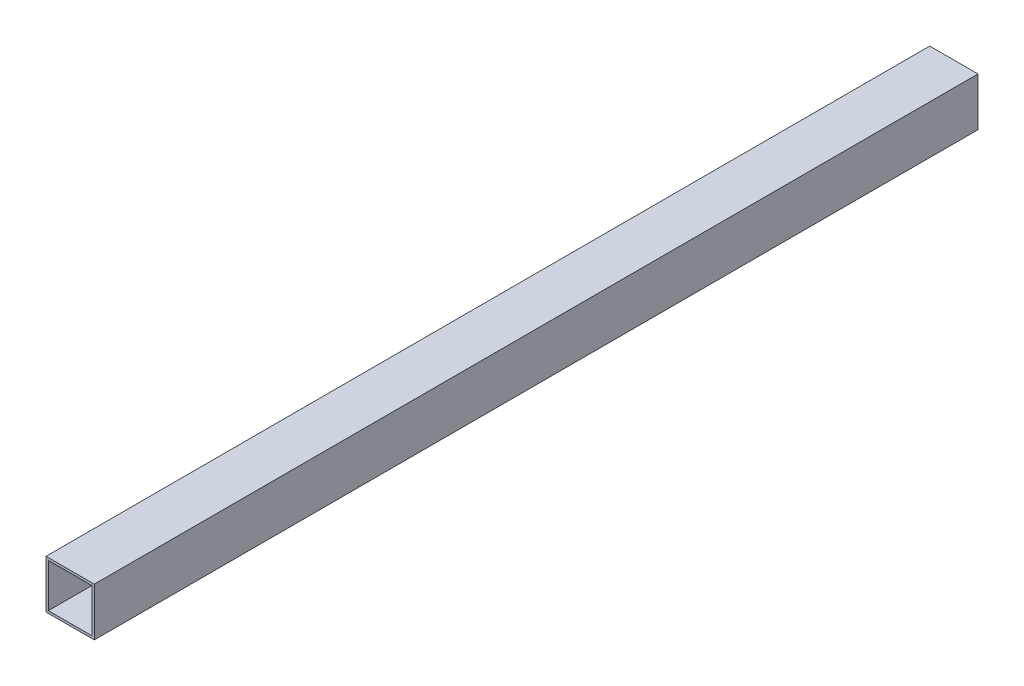
ISO-10303-21;
HEADER;
FILE_DESCRIPTION(('STEP AP214'),'2;1');
FILE_NAME('part.step','',(''),(''),'','','');
FILE_SCHEMA(('AUTOMOTIVE_DESIGN { 1 0 10303 214 1 1 1 1 }'));
ENDSEC;
DATA;
#1=APPLICATION_CONTEXT('core data for automotive mechanical design processes');
#2=APPLICATION_PROTOCOL_DEFINITION('international standard','automotive_design',2000,#1);
#3=PRODUCT_CONTEXT('',#1,'mechanical');
#4=PRODUCT('Part','Part','',(#3));
#5=PRODUCT_RELATED_PRODUCT_CATEGORY('part','',(#4));
#6=PRODUCT_DEFINITION_FORMATION('','',#4);
#7=PRODUCT_DEFINITION_CONTEXT('part definition',#1,'design');
#8=PRODUCT_DEFINITION('design','',#6,#7);
#9=PRODUCT_DEFINITION_SHAPE('','',#8);
#10=(LENGTH_UNIT() NAMED_UNIT(*) SI_UNIT(.MILLI.,.METRE.));
#11=(NAMED_UNIT(*) PLANE_ANGLE_UNIT() SI_UNIT($,.RADIAN.));
#12=(NAMED_UNIT(*) SI_UNIT($,.STERADIAN.) SOLID_ANGLE_UNIT());
#13=UNCERTAINTY_MEASURE_WITH_UNIT(LENGTH_MEASURE(1.E-05),#10,'distance_accuracy_value','');
#14=(GEOMETRIC_REPRESENTATION_CONTEXT(3) GLOBAL_UNCERTAINTY_ASSIGNED_CONTEXT((#13)) GLOBAL_UNIT_ASSIGNED_CONTEXT((#10,
#11,#12)) REPRESENTATION_CONTEXT('',''));
#15=CARTESIAN_POINT('',(0.,0.,0.));
#16=DIRECTION('',(0.,0.,1.));
#17=DIRECTION('',(1.,0.,0.));
#18=AXIS2_PLACEMENT_3D('',#15,#16,#17);
#19=CARTESIAN_POINT('',(0.,0.,18300.));
#20=DIRECTION('',(0.,0.,-1.));
#21=DIRECTION('',(-1.,0.,0.));
#22=AXIS2_PLACEMENT_3D('',#19,#20,#21);
#23=PLANE('',#22);
#24=DIRECTION('',(0.,1.,0.));
#25=VECTOR('',#24,1.);
#26=CARTESIAN_POINT('',(500.,-500.,18300.));
#27=LINE('',#26,#25);
#28=CARTESIAN_POINT('',(500.,-500.,18300.));
#29=VERTEX_POINT('',#28);
#30=CARTESIAN_POINT('',(500.,500.,18300.));
#31=VERTEX_POINT('',#30);
#32=EDGE_CURVE('E134',#29,#31,#27,.T.);
#33=ORIENTED_EDGE('',*,*,#32,.T.);
#34=DIRECTION('',(-1.,0.,0.));
#35=VECTOR('',#34,1.);
#36=CARTESIAN_POINT('',(-500.,500.,18300.));
#37=LINE('',#36,#35);
#38=CARTESIAN_POINT('',(-500.,500.,18300.));
#39=VERTEX_POINT('',#38);
#40=EDGE_CURVE('E137',#31,#39,#37,.T.);
#41=ORIENTED_EDGE('',*,*,#40,.T.);
#42=DIRECTION('',(0.,-1.,0.));
#43=VECTOR('',#42,1.);
#44=CARTESIAN_POINT('',(-500.,-500.,18300.));
#45=LINE('',#44,#43);
#46=CARTESIAN_POINT('',(-500.,-500.,18300.));
#47=VERTEX_POINT('',#46);
#48=EDGE_CURVE('E140',#39,#47,#45,.T.);
#49=ORIENTED_EDGE('',*,*,#48,.T.);
#50=DIRECTION('',(1.,0.,0.));
#51=VECTOR('',#50,1.);
#52=CARTESIAN_POINT('',(-500.,-500.,18300.));
#53=LINE('',#52,#51);
#54=EDGE_CURVE('E142',#47,#29,#53,.T.);
#55=ORIENTED_EDGE('',*,*,#54,.T.);
#56=EDGE_LOOP('',(#33,#41,#49,#55));
#57=FACE_BOUND('',#56,.T.);
#58=DIRECTION('',(0.,-1.,0.));
#59=VECTOR('',#58,1.);
#60=CARTESIAN_POINT('',(-450.,-450.,18300.));
#61=LINE('',#60,#59);
#62=CARTESIAN_POINT('',(-450.,450.,18300.));
#63=VERTEX_POINT('',#62);
#64=CARTESIAN_POINT('',(-450.,-450.,18300.));
#65=VERTEX_POINT('',#64);
#66=EDGE_CURVE('E98',#63,#65,#61,.T.);
#67=ORIENTED_EDGE('',*,*,#66,.F.);
#68=DIRECTION('',(-1.,0.,0.));
#69=VECTOR('',#68,1.);
#70=CARTESIAN_POINT('',(-450.,450.,18300.));
#71=LINE('',#70,#69);
#72=CARTESIAN_POINT('',(450.,450.,18300.));
#73=VERTEX_POINT('',#72);
#74=EDGE_CURVE('E120',#73,#63,#71,.T.);
#75=ORIENTED_EDGE('',*,*,#74,.F.);
#76=DIRECTION('',(0.,1.,0.));
#77=VECTOR('',#76,1.);
#78=CARTESIAN_POINT('',(450.,-450.,18300.));
#79=LINE('',#78,#77);
#80=CARTESIAN_POINT('',(450.,-450.,18300.));
#81=VERTEX_POINT('',#80);
#82=EDGE_CURVE('E118',#81,#73,#79,.T.);
#83=ORIENTED_EDGE('',*,*,#82,.F.);
#84=DIRECTION('',(1.,0.,0.));
#85=VECTOR('',#84,1.);
#86=CARTESIAN_POINT('',(-450.,-450.,18300.));
#87=LINE('',#86,#85);
#88=EDGE_CURVE('E106',#65,#81,#87,.T.);
#89=ORIENTED_EDGE('',*,*,#88,.F.);
#90=EDGE_LOOP('',(#67,#75,#83,#89));
#91=FACE_BOUND('',#90,.T.);
#92=ADVANCED_FACE('F33',(#57,#91),#23,.F.);
#93=CARTESIAN_POINT('',(0.,0.,0.));
#94=DIRECTION('',(0.,0.,-1.));
#95=DIRECTION('',(-1.,0.,0.));
#96=AXIS2_PLACEMENT_3D('',#93,#94,#95);
#97=PLANE('',#96);
#98=DIRECTION('',(0.,1.,0.));
#99=VECTOR('',#98,1.);
#100=CARTESIAN_POINT('',(500.,-500.,0.));
#101=LINE('',#100,#99);
#102=CARTESIAN_POINT('',(500.,-500.,0.));
#103=VERTEX_POINT('',#102);
#104=CARTESIAN_POINT('',(500.,500.,0.));
#105=VERTEX_POINT('',#104);
#106=EDGE_CURVE('E114',#103,#105,#101,.T.);
#107=ORIENTED_EDGE('',*,*,#106,.F.);
#108=DIRECTION('',(1.,0.,0.));
#109=VECTOR('',#108,1.);
#110=CARTESIAN_POINT('',(-500.,-500.,0.));
#111=LINE('',#110,#109);
#112=CARTESIAN_POINT('',(-500.,-500.,0.));
#113=VERTEX_POINT('',#112);
#114=EDGE_CURVE('E138',#113,#103,#111,.T.);
#115=ORIENTED_EDGE('',*,*,#114,.F.);
#116=DIRECTION('',(0.,-1.,0.));
#117=VECTOR('',#116,1.);
#118=CARTESIAN_POINT('',(-500.,-500.,0.));
#119=LINE('',#118,#117);
#120=CARTESIAN_POINT('',(-500.,500.,0.));
#121=VERTEX_POINT('',#120);
#122=EDGE_CURVE('E149',#121,#113,#119,.T.);
#123=ORIENTED_EDGE('',*,*,#122,.F.);
#124=DIRECTION('',(-1.,0.,0.));
#125=VECTOR('',#124,1.);
#126=CARTESIAN_POINT('',(-500.,500.,0.));
#127=LINE('',#126,#125);
#128=EDGE_CURVE('E147',#105,#121,#127,.T.);
#129=ORIENTED_EDGE('',*,*,#128,.F.);
#130=EDGE_LOOP('',(#107,#115,#123,#129));
#131=FACE_BOUND('',#130,.T.);
#132=DIRECTION('',(-1.,0.,0.));
#133=VECTOR('',#132,1.);
#134=CARTESIAN_POINT('',(-450.,450.,0.));
#135=LINE('',#134,#133);
#136=CARTESIAN_POINT('',(450.,450.,0.));
#137=VERTEX_POINT('',#136);
#138=CARTESIAN_POINT('',(-450.,450.,0.));
#139=VERTEX_POINT('',#138);
#140=EDGE_CURVE('E107',#137,#139,#135,.T.);
#141=ORIENTED_EDGE('',*,*,#140,.T.);
#142=DIRECTION('',(0.,-1.,0.));
#143=VECTOR('',#142,1.);
#144=CARTESIAN_POINT('',(-450.,-450.,0.));
#145=LINE('',#144,#143);
#146=CARTESIAN_POINT('',(-450.,-450.,0.));
#147=VERTEX_POINT('',#146);
#148=EDGE_CURVE('E56',#139,#147,#145,.T.);
#149=ORIENTED_EDGE('',*,*,#148,.T.);
#150=DIRECTION('',(1.,0.,0.));
#151=VECTOR('',#150,1.);
#152=CARTESIAN_POINT('',(-450.,-450.,0.));
#153=LINE('',#152,#151);
#154=CARTESIAN_POINT('',(450.,-450.,0.));
#155=VERTEX_POINT('',#154);
#156=EDGE_CURVE('E113',#147,#155,#153,.T.);
#157=ORIENTED_EDGE('',*,*,#156,.T.);
#158=DIRECTION('',(0.,1.,0.));
#159=VECTOR('',#158,1.);
#160=CARTESIAN_POINT('',(450.,-450.,0.));
#161=LINE('',#160,#159);
#162=EDGE_CURVE('E126',#155,#137,#161,.T.);
#163=ORIENTED_EDGE('',*,*,#162,.T.);
#164=EDGE_LOOP('',(#141,#149,#157,#163));
#165=FACE_BOUND('',#164,.T.);
#166=ADVANCED_FACE('F167',(#131,#165),#97,.T.);
#167=CARTESIAN_POINT('',(500.,-500.,18300.));
#168=DIRECTION('',(-1.,0.,0.));
#169=DIRECTION('',(0.,0.,1.));
#170=AXIS2_PLACEMENT_3D('',#167,#168,#169);
#171=PLANE('',#170);
#172=ORIENTED_EDGE('',*,*,#106,.T.);
#173=DIRECTION('',(0.,0.,-1.));
#174=VECTOR('',#173,1.);
#175=CARTESIAN_POINT('',(500.,500.,18300.));
#176=LINE('',#175,#174);
#177=EDGE_CURVE('E11',#31,#105,#176,.T.);
#178=ORIENTED_EDGE('',*,*,#177,.F.);
#179=ORIENTED_EDGE('',*,*,#32,.F.);
#180=DIRECTION('',(0.,0.,-1.));
#181=VECTOR('',#180,1.);
#182=CARTESIAN_POINT('',(500.,-500.,18300.));
#183=LINE('',#182,#181);
#184=EDGE_CURVE('E144',#29,#103,#183,.T.);
#185=ORIENTED_EDGE('',*,*,#184,.T.);
#186=EDGE_LOOP('',(#172,#178,#179,#185));
#187=FACE_BOUND('',#186,.T.);
#188=ADVANCED_FACE('F35',(#187),#171,.F.);
#189=CARTESIAN_POINT('',(-500.,500.,18300.));
#190=DIRECTION('',(0.,-1.,0.));
#191=DIRECTION('',(0.,0.,-1.));
#192=AXIS2_PLACEMENT_3D('',#189,#190,#191);
#193=PLANE('',#192);
#194=ORIENTED_EDGE('',*,*,#128,.T.);
#195=DIRECTION('',(0.,0.,-1.));
#196=VECTOR('',#195,1.);
#197=CARTESIAN_POINT('',(-500.,500.,18300.));
#198=LINE('',#197,#196);
#199=EDGE_CURVE('E41',#39,#121,#198,.T.);
#200=ORIENTED_EDGE('',*,*,#199,.F.);
#201=ORIENTED_EDGE('',*,*,#40,.F.);
#202=ORIENTED_EDGE('',*,*,#177,.T.);
#203=EDGE_LOOP('',(#194,#200,#201,#202));
#204=FACE_BOUND('',#203,.T.);
#205=ADVANCED_FACE('F177',(#204),#193,.F.);
#206=CARTESIAN_POINT('',(-500.,-500.,18300.));
#207=DIRECTION('',(1.,0.,0.));
#208=DIRECTION('',(0.,0.,-1.));
#209=AXIS2_PLACEMENT_3D('',#206,#207,#208);
#210=PLANE('',#209);
#211=ORIENTED_EDGE('',*,*,#122,.T.);
#212=DIRECTION('',(0.,0.,-1.));
#213=VECTOR('',#212,1.);
#214=CARTESIAN_POINT('',(-500.,-500.,18300.));
#215=LINE('',#214,#213);
#216=EDGE_CURVE('E154',#47,#113,#215,.T.);
#217=ORIENTED_EDGE('',*,*,#216,.F.);
#218=ORIENTED_EDGE('',*,*,#48,.F.);
#219=ORIENTED_EDGE('',*,*,#199,.T.);
#220=EDGE_LOOP('',(#211,#217,#218,#219));
#221=FACE_BOUND('',#220,.T.);
#222=ADVANCED_FACE('F161',(#221),#210,.F.);
#223=CARTESIAN_POINT('',(-500.,-500.,18300.));
#224=DIRECTION('',(0.,1.,0.));
#225=DIRECTION('',(0.,0.,1.));
#226=AXIS2_PLACEMENT_3D('',#223,#224,#225);
#227=PLANE('',#226);
#228=ORIENTED_EDGE('',*,*,#114,.T.);
#229=ORIENTED_EDGE('',*,*,#184,.F.);
#230=ORIENTED_EDGE('',*,*,#54,.F.);
#231=ORIENTED_EDGE('',*,*,#216,.T.);
#232=EDGE_LOOP('',(#228,#229,#230,#231));
#233=FACE_BOUND('',#232,.T.);
#234=ADVANCED_FACE('F171',(#233),#227,.F.);
#235=CARTESIAN_POINT('',(-450.,-450.,18300.));
#236=DIRECTION('',(1.,0.,0.));
#237=DIRECTION('',(0.,0.,-1.));
#238=AXIS2_PLACEMENT_3D('',#235,#236,#237);
#239=PLANE('',#238);
#240=ORIENTED_EDGE('',*,*,#148,.F.);
#241=DIRECTION('',(0.,0.,-1.));
#242=VECTOR('',#241,1.);
#243=CARTESIAN_POINT('',(-450.,450.,18300.));
#244=LINE('',#243,#242);
#245=EDGE_CURVE('E102',#63,#139,#244,.T.);
#246=ORIENTED_EDGE('',*,*,#245,.F.);
#247=ORIENTED_EDGE('',*,*,#66,.T.);
#248=DIRECTION('',(0.,0.,-1.));
#249=VECTOR('',#248,1.);
#250=CARTESIAN_POINT('',(-450.,-450.,18300.));
#251=LINE('',#250,#249);
#252=EDGE_CURVE('E101',#65,#147,#251,.T.);
#253=ORIENTED_EDGE('',*,*,#252,.T.);
#254=EDGE_LOOP('',(#240,#246,#247,#253));
#255=FACE_BOUND('',#254,.T.);
#256=ADVANCED_FACE('F100',(#255),#239,.T.);
#257=CARTESIAN_POINT('',(-450.,-450.,18300.));
#258=DIRECTION('',(0.,1.,0.));
#259=DIRECTION('',(0.,0.,1.));
#260=AXIS2_PLACEMENT_3D('',#257,#258,#259);
#261=PLANE('',#260);
#262=ORIENTED_EDGE('',*,*,#156,.F.);
#263=ORIENTED_EDGE('',*,*,#252,.F.);
#264=ORIENTED_EDGE('',*,*,#88,.T.);
#265=DIRECTION('',(0.,0.,-1.));
#266=VECTOR('',#265,1.);
#267=CARTESIAN_POINT('',(450.,-450.,18300.));
#268=LINE('',#267,#266);
#269=EDGE_CURVE('E115',#81,#155,#268,.T.);
#270=ORIENTED_EDGE('',*,*,#269,.T.);
#271=EDGE_LOOP('',(#262,#263,#264,#270));
#272=FACE_BOUND('',#271,.T.);
#273=ADVANCED_FACE('F110',(#272),#261,.T.);
#274=CARTESIAN_POINT('',(450.,-450.,18300.));
#275=DIRECTION('',(-1.,0.,0.));
#276=DIRECTION('',(0.,-1.,0.));
#277=AXIS2_PLACEMENT_3D('',#274,#275,#276);
#278=PLANE('',#277);
#279=ORIENTED_EDGE('',*,*,#162,.F.);
#280=ORIENTED_EDGE('',*,*,#269,.F.);
#281=ORIENTED_EDGE('',*,*,#82,.T.);
#282=DIRECTION('',(0.,0.,-1.));
#283=VECTOR('',#282,1.);
#284=CARTESIAN_POINT('',(450.,450.,18300.));
#285=LINE('',#284,#283);
#286=EDGE_CURVE('E48',#73,#137,#285,.T.);
#287=ORIENTED_EDGE('',*,*,#286,.T.);
#288=EDGE_LOOP('',(#279,#280,#281,#287));
#289=FACE_BOUND('',#288,.T.);
#290=ADVANCED_FACE('F200',(#289),#278,.T.);
#291=CARTESIAN_POINT('',(-450.,450.,18300.));
#292=DIRECTION('',(0.,-1.,0.));
#293=DIRECTION('',(1.,0.,0.));
#294=AXIS2_PLACEMENT_3D('',#291,#292,#293);
#295=PLANE('',#294);
#296=ORIENTED_EDGE('',*,*,#140,.F.);
#297=ORIENTED_EDGE('',*,*,#286,.F.);
#298=ORIENTED_EDGE('',*,*,#74,.T.);
#299=ORIENTED_EDGE('',*,*,#245,.T.);
#300=EDGE_LOOP('',(#296,#297,#298,#299));
#301=FACE_BOUND('',#300,.T.);
#302=ADVANCED_FACE('F204',(#301),#295,.T.);
#303=CLOSED_SHELL('',(#92,#166,#188,#205,#222,#234,#256,#273,#290,#302));
#304=MANIFOLD_SOLID_BREP('B2',#303);
#305=ADVANCED_BREP_SHAPE_REPRESENTATION('',(#18,#304),#14);
#306=SHAPE_DEFINITION_REPRESENTATION(#9,#305);
ENDSEC;
END-ISO-10303-21;
